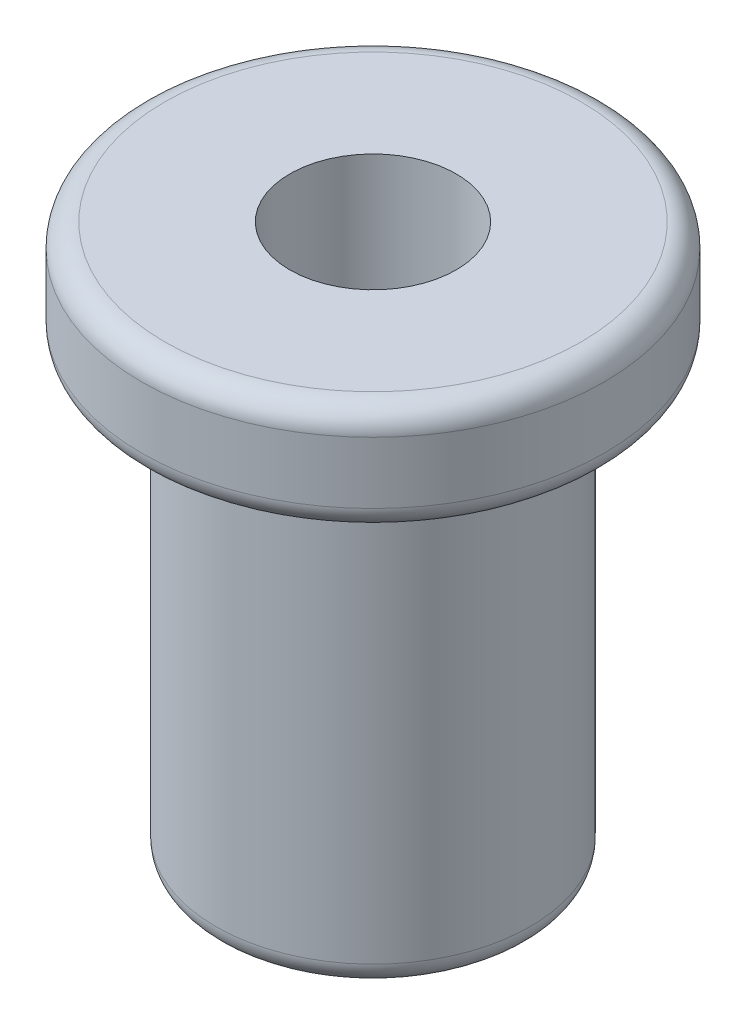
ISO-10303-21;
HEADER;
FILE_DESCRIPTION(('STEP AP214'),'2;1');
FILE_NAME('part.step','',(''),(''),'','','');
FILE_SCHEMA(('AUTOMOTIVE_DESIGN { 1 0 10303 214 1 1 1 1 }'));
ENDSEC;
DATA;
#1=APPLICATION_CONTEXT('core data for automotive mechanical design processes');
#2=APPLICATION_PROTOCOL_DEFINITION('international standard','automotive_design',2000,#1);
#3=PRODUCT_CONTEXT('',#1,'mechanical');
#4=PRODUCT('Part','Part','',(#3));
#5=PRODUCT_RELATED_PRODUCT_CATEGORY('part','',(#4));
#6=PRODUCT_DEFINITION_FORMATION('','',#4);
#7=PRODUCT_DEFINITION_CONTEXT('part definition',#1,'design');
#8=PRODUCT_DEFINITION('design','',#6,#7);
#9=PRODUCT_DEFINITION_SHAPE('','',#8);
#10=(LENGTH_UNIT() NAMED_UNIT(*) SI_UNIT(.MILLI.,.METRE.));
#11=(NAMED_UNIT(*) PLANE_ANGLE_UNIT() SI_UNIT($,.RADIAN.));
#12=(NAMED_UNIT(*) SI_UNIT($,.STERADIAN.) SOLID_ANGLE_UNIT());
#13=UNCERTAINTY_MEASURE_WITH_UNIT(LENGTH_MEASURE(1.E-05),#10,'distance_accuracy_value','');
#14=(GEOMETRIC_REPRESENTATION_CONTEXT(3) GLOBAL_UNCERTAINTY_ASSIGNED_CONTEXT((#13)) GLOBAL_UNIT_ASSIGNED_CONTEXT((#10,
#11,#12)) REPRESENTATION_CONTEXT('',''));
#15=CARTESIAN_POINT('',(0.,0.,0.));
#16=DIRECTION('',(0.,0.,1.));
#17=DIRECTION('',(1.,0.,0.));
#18=AXIS2_PLACEMENT_3D('',#15,#16,#17);
#19=CARTESIAN_POINT('',(0.,0.,-7.5));
#20=DIRECTION('',(0.,-1.,0.));
#21=DIRECTION('',(0.,0.,-1.));
#22=AXIS2_PLACEMENT_3D('',#19,#20,#21);
#23=PLANE('',#22);
#24=CARTESIAN_POINT('',(0.,0.,0.));
#25=DIRECTION('',(0.,-1.,0.));
#26=DIRECTION('',(0.,0.,-1.));
#27=AXIS2_PLACEMENT_3D('',#24,#25,#26);
#28=CIRCLE('',#27,6.75);
#29=CARTESIAN_POINT('',(0.,0.,-6.75));
#30=VERTEX_POINT('',#29);
#31=EDGE_CURVE('E10',#30,#30,#28,.F.);
#32=ORIENTED_EDGE('',*,*,#31,.T.);
#33=EDGE_LOOP('',(#32));
#34=FACE_BOUND('',#33,.T.);
#35=CARTESIAN_POINT('',(0.,0.,0.));
#36=DIRECTION('',(0.,1.,0.));
#37=DIRECTION('',(0.,0.,1.));
#38=AXIS2_PLACEMENT_3D('',#35,#36,#37);
#39=CIRCLE('',#38,2.7);
#40=CARTESIAN_POINT('',(0.,0.,2.7));
#41=VERTEX_POINT('',#40);
#42=EDGE_CURVE('E60',#41,#41,#39,.T.);
#43=ORIENTED_EDGE('',*,*,#42,.F.);
#44=EDGE_LOOP('',(#43));
#45=FACE_BOUND('',#44,.T.);
#46=ADVANCED_FACE('F34',(#34,#45),#23,.F.);
#47=CARTESIAN_POINT('',(0.,0.,0.));
#48=DIRECTION('',(0.,1.,0.));
#49=DIRECTION('',(0.,0.,1.));
#50=AXIS2_PLACEMENT_3D('',#47,#48,#49);
#51=CYLINDRICAL_SURFACE('',#50,2.7);
#52=CARTESIAN_POINT('',(0.,-15.,0.));
#53=DIRECTION('',(0.,1.,0.));
#54=DIRECTION('',(0.,0.,1.));
#55=AXIS2_PLACEMENT_3D('',#52,#53,#54);
#56=CIRCLE('',#55,2.7);
#57=CARTESIAN_POINT('',(0.,-15.,2.7));
#58=VERTEX_POINT('',#57);
#59=EDGE_CURVE('E63',#58,#58,#56,.T.);
#60=ORIENTED_EDGE('',*,*,#59,.F.);
#61=EDGE_LOOP('',(#60));
#62=FACE_BOUND('',#61,.T.);
#63=ORIENTED_EDGE('',*,*,#42,.T.);
#64=EDGE_LOOP('',(#63));
#65=FACE_BOUND('',#64,.T.);
#66=ADVANCED_FACE('F93',(#62,#65),#51,.F.);
#67=CARTESIAN_POINT('',(0.,-15.,-2.7));
#68=DIRECTION('',(0.,-1.,0.));
#69=DIRECTION('',(0.,0.,-1.));
#70=AXIS2_PLACEMENT_3D('',#67,#68,#69);
#71=PLANE('',#70);
#72=CARTESIAN_POINT('',(0.,-15.,0.));
#73=DIRECTION('',(0.,1.,0.));
#74=DIRECTION('',(0.,0.,1.));
#75=AXIS2_PLACEMENT_3D('',#72,#73,#74);
#76=CIRCLE('',#75,2.);
#77=CARTESIAN_POINT('',(0.,-15.,2.));
#78=VERTEX_POINT('',#77);
#79=EDGE_CURVE('E66',#78,#78,#76,.T.);
#80=ORIENTED_EDGE('',*,*,#79,.F.);
#81=EDGE_LOOP('',(#80));
#82=FACE_BOUND('',#81,.T.);
#83=ORIENTED_EDGE('',*,*,#59,.T.);
#84=EDGE_LOOP('',(#83));
#85=FACE_BOUND('',#84,.T.);
#86=ADVANCED_FACE('F98',(#82,#85),#71,.F.);
#87=CARTESIAN_POINT('',(0.,0.,0.));
#88=DIRECTION('',(0.,1.,0.));
#89=DIRECTION('',(0.,0.,1.));
#90=AXIS2_PLACEMENT_3D('',#87,#88,#89);
#91=CYLINDRICAL_SURFACE('',#90,2.);
#92=CARTESIAN_POINT('',(0.,-18.,0.));
#93=DIRECTION('',(0.,1.,0.));
#94=DIRECTION('',(0.,0.,1.));
#95=AXIS2_PLACEMENT_3D('',#92,#93,#94);
#96=CIRCLE('',#95,2.);
#97=CARTESIAN_POINT('',(0.,-18.,2.));
#98=VERTEX_POINT('',#97);
#99=EDGE_CURVE('E69',#98,#98,#96,.T.);
#100=ORIENTED_EDGE('',*,*,#99,.F.);
#101=EDGE_LOOP('',(#100));
#102=FACE_BOUND('',#101,.T.);
#103=ORIENTED_EDGE('',*,*,#79,.T.);
#104=EDGE_LOOP('',(#103));
#105=FACE_BOUND('',#104,.T.);
#106=ADVANCED_FACE('F89',(#102,#105),#91,.F.);
#107=CARTESIAN_POINT('',(0.,-18.,-2.));
#108=DIRECTION('',(0.,1.,0.));
#109=DIRECTION('',(0.,0.,1.));
#110=AXIS2_PLACEMENT_3D('',#107,#108,#109);
#111=PLANE('',#110);
#112=CARTESIAN_POINT('',(0.,-18.,0.));
#113=DIRECTION('',(0.,1.,0.));
#114=DIRECTION('',(0.,0.,1.));
#115=AXIS2_PLACEMENT_3D('',#112,#113,#114);
#116=CIRCLE('',#115,4.35);
#117=CARTESIAN_POINT('',(0.,-18.,4.35));
#118=VERTEX_POINT('',#117);
#119=EDGE_CURVE('E54',#118,#118,#116,.F.);
#120=ORIENTED_EDGE('',*,*,#119,.T.);
#121=EDGE_LOOP('',(#120));
#122=FACE_BOUND('',#121,.T.);
#123=ORIENTED_EDGE('',*,*,#99,.T.);
#124=EDGE_LOOP('',(#123));
#125=FACE_BOUND('',#124,.T.);
#126=ADVANCED_FACE('F80',(#122,#125),#111,.F.);
#127=CARTESIAN_POINT('',(0.,0.,0.));
#128=DIRECTION('',(0.,1.,0.));
#129=DIRECTION('',(0.,0.,1.));
#130=AXIS2_PLACEMENT_3D('',#127,#128,#129);
#131=CYLINDRICAL_SURFACE('',#130,5.1);
#132=CARTESIAN_POINT('',(0.,-17.25,0.));
#133=DIRECTION('',(0.,1.,0.));
#134=DIRECTION('',(0.,0.,1.));
#135=AXIS2_PLACEMENT_3D('',#132,#133,#134);
#136=CIRCLE('',#135,5.1);
#137=CARTESIAN_POINT('',(0.,-17.25,5.1));
#138=VERTEX_POINT('',#137);
#139=EDGE_CURVE('E57',#138,#138,#136,.T.);
#140=ORIENTED_EDGE('',*,*,#139,.T.);
#141=EDGE_LOOP('',(#140));
#142=FACE_BOUND('',#141,.T.);
#143=CARTESIAN_POINT('',(0.,-3.5,0.));
#144=DIRECTION('',(0.,1.,0.));
#145=DIRECTION('',(0.,0.,1.));
#146=AXIS2_PLACEMENT_3D('',#143,#144,#145);
#147=CIRCLE('',#146,5.1);
#148=CARTESIAN_POINT('',(0.,-3.5,5.1));
#149=VERTEX_POINT('',#148);
#150=EDGE_CURVE('E72',#149,#149,#147,.T.);
#151=ORIENTED_EDGE('',*,*,#150,.F.);
#152=EDGE_LOOP('',(#151));
#153=FACE_BOUND('',#152,.T.);
#154=ADVANCED_FACE('F78',(#142,#153),#131,.T.);
#155=CARTESIAN_POINT('',(0.,-3.5,-5.1));
#156=DIRECTION('',(0.,1.,0.));
#157=DIRECTION('',(0.,0.,1.));
#158=AXIS2_PLACEMENT_3D('',#155,#156,#157);
#159=PLANE('',#158);
#160=CARTESIAN_POINT('',(0.,-3.5,0.));
#161=DIRECTION('',(0.,1.,0.));
#162=DIRECTION('',(0.,0.,1.));
#163=AXIS2_PLACEMENT_3D('',#160,#161,#162);
#164=CIRCLE('',#163,6.75);
#165=CARTESIAN_POINT('',(0.,-3.5,6.75));
#166=VERTEX_POINT('',#165);
#167=EDGE_CURVE('E41',#166,#166,#164,.F.);
#168=ORIENTED_EDGE('',*,*,#167,.T.);
#169=EDGE_LOOP('',(#168));
#170=FACE_BOUND('',#169,.T.);
#171=ORIENTED_EDGE('',*,*,#150,.T.);
#172=EDGE_LOOP('',(#171));
#173=FACE_BOUND('',#172,.T.);
#174=ADVANCED_FACE('F76',(#170,#173),#159,.F.);
#175=CARTESIAN_POINT('',(0.,0.,0.));
#176=DIRECTION('',(0.,1.,0.));
#177=DIRECTION('',(0.,0.,1.));
#178=AXIS2_PLACEMENT_3D('',#175,#176,#177);
#179=CYLINDRICAL_SURFACE('',#178,7.5);
#180=CARTESIAN_POINT('',(0.,-2.75,0.));
#181=DIRECTION('',(0.,1.,0.));
#182=DIRECTION('',(0.,0.,1.));
#183=AXIS2_PLACEMENT_3D('',#180,#181,#182);
#184=CIRCLE('',#183,7.5);
#185=CARTESIAN_POINT('',(0.,-2.75,7.5));
#186=VERTEX_POINT('',#185);
#187=EDGE_CURVE('E45',#186,#186,#184,.T.);
#188=ORIENTED_EDGE('',*,*,#187,.T.);
#189=EDGE_LOOP('',(#188));
#190=FACE_BOUND('',#189,.T.);
#191=CARTESIAN_POINT('',(0.,-0.75,0.));
#192=DIRECTION('',(0.,-1.,0.));
#193=DIRECTION('',(0.,0.,-1.));
#194=AXIS2_PLACEMENT_3D('',#191,#192,#193);
#195=CIRCLE('',#194,7.5);
#196=CARTESIAN_POINT('',(0.,-0.75,-7.5));
#197=VERTEX_POINT('',#196);
#198=EDGE_CURVE('E49',#197,#197,#195,.T.);
#199=ORIENTED_EDGE('',*,*,#198,.T.);
#200=EDGE_LOOP('',(#199));
#201=FACE_BOUND('',#200,.T.);
#202=ADVANCED_FACE('F87',(#190,#201),#179,.T.);
#203=CARTESIAN_POINT('',(0.,-17.25,0.));
#204=DIRECTION('',(0.,1.,0.));
#205=DIRECTION('',(0.,0.,1.));
#206=AXIS2_PLACEMENT_3D('',#203,#204,#205);
#207=TOROIDAL_SURFACE('',#206,4.35,0.75);
#208=ORIENTED_EDGE('',*,*,#119,.F.);
#209=EDGE_LOOP('',(#208));
#210=FACE_BOUND('',#209,.T.);
#211=ORIENTED_EDGE('',*,*,#139,.F.);
#212=EDGE_LOOP('',(#211));
#213=FACE_BOUND('',#212,.T.);
#214=ADVANCED_FACE('F104',(#210,#213),#207,.T.);
#215=CARTESIAN_POINT('',(0.,-2.75,0.));
#216=DIRECTION('',(0.,1.,0.));
#217=DIRECTION('',(0.,0.,1.));
#218=AXIS2_PLACEMENT_3D('',#215,#216,#217);
#219=TOROIDAL_SURFACE('',#218,6.75,0.75);
#220=ORIENTED_EDGE('',*,*,#167,.F.);
#221=EDGE_LOOP('',(#220));
#222=FACE_BOUND('',#221,.T.);
#223=ORIENTED_EDGE('',*,*,#187,.F.);
#224=EDGE_LOOP('',(#223));
#225=FACE_BOUND('',#224,.T.);
#226=ADVANCED_FACE('F106',(#222,#225),#219,.T.);
#227=CARTESIAN_POINT('',(0.,-0.75,0.));
#228=DIRECTION('',(0.,-1.,0.));
#229=DIRECTION('',(0.,0.,-1.));
#230=AXIS2_PLACEMENT_3D('',#227,#228,#229);
#231=TOROIDAL_SURFACE('',#230,6.75,0.75);
#232=ORIENTED_EDGE('',*,*,#198,.F.);
#233=EDGE_LOOP('',(#232));
#234=FACE_BOUND('',#233,.T.);
#235=ORIENTED_EDGE('',*,*,#31,.F.);
#236=EDGE_LOOP('',(#235));
#237=FACE_BOUND('',#236,.T.);
#238=ADVANCED_FACE('F36',(#234,#237),#231,.T.);
#239=CLOSED_SHELL('',(#46,#66,#86,#106,#126,#154,#174,#202,#214,#226,#238));
#240=MANIFOLD_SOLID_BREP('B2',#239);
#241=ADVANCED_BREP_SHAPE_REPRESENTATION('',(#18,#240),#14);
#242=SHAPE_DEFINITION_REPRESENTATION(#9,#241);
ENDSEC;
END-ISO-10303-21;
